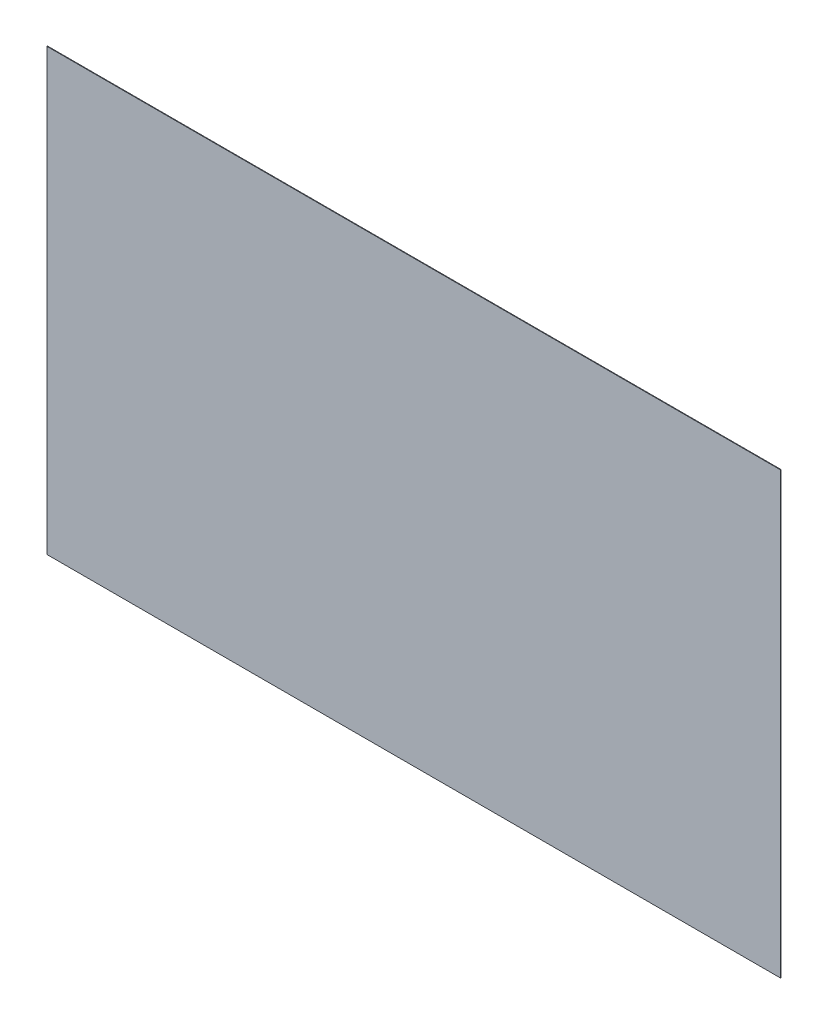
ISO-10303-21;
HEADER;
FILE_DESCRIPTION(('STEP AP214'),'2;1');
FILE_NAME('part.step','',(''),(''),'','','');
FILE_SCHEMA(('AUTOMOTIVE_DESIGN { 1 0 10303 214 1 1 1 1 }'));
ENDSEC;
DATA;
#1=APPLICATION_CONTEXT('core data for automotive mechanical design processes');
#2=APPLICATION_PROTOCOL_DEFINITION('international standard','automotive_design',2000,#1);
#3=PRODUCT_CONTEXT('',#1,'mechanical');
#4=PRODUCT('Part','Part','',(#3));
#5=PRODUCT_RELATED_PRODUCT_CATEGORY('part','',(#4));
#6=PRODUCT_DEFINITION_FORMATION('','',#4);
#7=PRODUCT_DEFINITION_CONTEXT('part definition',#1,'design');
#8=PRODUCT_DEFINITION('design','',#6,#7);
#9=PRODUCT_DEFINITION_SHAPE('','',#8);
#10=(LENGTH_UNIT() NAMED_UNIT(*) SI_UNIT(.MILLI.,.METRE.));
#11=(NAMED_UNIT(*) PLANE_ANGLE_UNIT() SI_UNIT($,.RADIAN.));
#12=(NAMED_UNIT(*) SI_UNIT($,.STERADIAN.) SOLID_ANGLE_UNIT());
#13=UNCERTAINTY_MEASURE_WITH_UNIT(LENGTH_MEASURE(1.E-05),#10,'distance_accuracy_value','');
#14=(GEOMETRIC_REPRESENTATION_CONTEXT(3) GLOBAL_UNCERTAINTY_ASSIGNED_CONTEXT((#13)) GLOBAL_UNIT_ASSIGNED_CONTEXT((#10,
#11,#12)) REPRESENTATION_CONTEXT('',''));
#15=CARTESIAN_POINT('',(0.,0.,0.));
#16=DIRECTION('',(0.,0.,1.));
#17=DIRECTION('',(1.,0.,0.));
#18=AXIS2_PLACEMENT_3D('',#15,#16,#17);
#19=CARTESIAN_POINT('',(0.,0.,0.8));
#20=DIRECTION('',(1.,0.,0.));
#21=DIRECTION('',(0.,1.,0.));
#22=AXIS2_PLACEMENT_3D('',#19,#20,#21);
#23=PLANE('',#22);
#24=DIRECTION('',(0.,-1.,0.));
#25=VECTOR('',#24,1.);
#26=CARTESIAN_POINT('',(0.,0.,0.));
#27=LINE('',#26,#25);
#28=CARTESIAN_POINT('',(-3.33066907387547E-13,600.,0.));
#29=VERTEX_POINT('',#28);
#30=CARTESIAN_POINT('',(0.,0.,0.));
#31=VERTEX_POINT('',#30);
#32=EDGE_CURVE('E99',#29,#31,#27,.T.);
#33=ORIENTED_EDGE('',*,*,#32,.T.);
#34=DIRECTION('',(0.,0.,-1.));
#35=VECTOR('',#34,1.);
#36=CARTESIAN_POINT('',(0.,0.,0.8));
#37=LINE('',#36,#35);
#38=CARTESIAN_POINT('',(0.,0.,0.8));
#39=VERTEX_POINT('',#38);
#40=EDGE_CURVE('E11',#39,#31,#37,.T.);
#41=ORIENTED_EDGE('',*,*,#40,.F.);
#42=DIRECTION('',(0.,-1.,0.));
#43=VECTOR('',#42,1.);
#44=CARTESIAN_POINT('',(0.,0.,0.8));
#45=LINE('',#44,#43);
#46=CARTESIAN_POINT('',(-3.33066907387547E-13,600.,0.8));
#47=VERTEX_POINT('',#46);
#48=EDGE_CURVE('E87',#47,#39,#45,.T.);
#49=ORIENTED_EDGE('',*,*,#48,.F.);
#50=DIRECTION('',(0.,0.,-1.));
#51=VECTOR('',#50,1.);
#52=CARTESIAN_POINT('',(-3.33066907387547E-13,600.,0.8));
#53=LINE('',#52,#51);
#54=EDGE_CURVE('E95',#47,#29,#53,.T.);
#55=ORIENTED_EDGE('',*,*,#54,.T.);
#56=EDGE_LOOP('',(#33,#41,#49,#55));
#57=FACE_BOUND('',#56,.T.);
#58=ADVANCED_FACE('F36',(#57),#23,.F.);
#59=CARTESIAN_POINT('',(0.,0.,0.8));
#60=DIRECTION('',(0.,1.,0.));
#61=DIRECTION('',(0.,0.,1.));
#62=AXIS2_PLACEMENT_3D('',#59,#60,#61);
#63=PLANE('',#62);
#64=DIRECTION('',(1.,0.,0.));
#65=VECTOR('',#64,1.);
#66=CARTESIAN_POINT('',(0.,0.,0.));
#67=LINE('',#66,#65);
#68=CARTESIAN_POINT('',(1000.,0.,0.));
#69=VERTEX_POINT('',#68);
#70=EDGE_CURVE('E91',#31,#69,#67,.T.);
#71=ORIENTED_EDGE('',*,*,#70,.T.);
#72=DIRECTION('',(0.,0.,-1.));
#73=VECTOR('',#72,1.);
#74=CARTESIAN_POINT('',(1000.,0.,0.8));
#75=LINE('',#74,#73);
#76=CARTESIAN_POINT('',(1000.,0.,0.8));
#77=VERTEX_POINT('',#76);
#78=EDGE_CURVE('E44',#77,#69,#75,.T.);
#79=ORIENTED_EDGE('',*,*,#78,.F.);
#80=DIRECTION('',(1.,0.,0.));
#81=VECTOR('',#80,1.);
#82=CARTESIAN_POINT('',(0.,0.,0.8));
#83=LINE('',#82,#81);
#84=EDGE_CURVE('E82',#39,#77,#83,.T.);
#85=ORIENTED_EDGE('',*,*,#84,.F.);
#86=ORIENTED_EDGE('',*,*,#40,.T.);
#87=EDGE_LOOP('',(#71,#79,#85,#86));
#88=FACE_BOUND('',#87,.T.);
#89=ADVANCED_FACE('F90',(#88),#63,.F.);
#90=CARTESIAN_POINT('',(1000.,0.,0.8));
#91=DIRECTION('',(-1.,0.,0.));
#92=DIRECTION('',(0.,-1.,0.));
#93=AXIS2_PLACEMENT_3D('',#90,#91,#92);
#94=PLANE('',#93);
#95=DIRECTION('',(0.,1.,0.));
#96=VECTOR('',#95,1.);
#97=CARTESIAN_POINT('',(1000.,0.,0.));
#98=LINE('',#97,#96);
#99=CARTESIAN_POINT('',(1000.,600.,0.));
#100=VERTEX_POINT('',#99);
#101=EDGE_CURVE('E69',#69,#100,#98,.T.);
#102=ORIENTED_EDGE('',*,*,#101,.T.);
#103=DIRECTION('',(0.,0.,-1.));
#104=VECTOR('',#103,1.);
#105=CARTESIAN_POINT('',(1000.,600.,0.8));
#106=LINE('',#105,#104);
#107=CARTESIAN_POINT('',(1000.,600.,0.8));
#108=VERTEX_POINT('',#107);
#109=EDGE_CURVE('E92',#108,#100,#106,.T.);
#110=ORIENTED_EDGE('',*,*,#109,.F.);
#111=DIRECTION('',(0.,1.,0.));
#112=VECTOR('',#111,1.);
#113=CARTESIAN_POINT('',(1000.,0.,0.8));
#114=LINE('',#113,#112);
#115=EDGE_CURVE('E85',#77,#108,#114,.T.);
#116=ORIENTED_EDGE('',*,*,#115,.F.);
#117=ORIENTED_EDGE('',*,*,#78,.T.);
#118=EDGE_LOOP('',(#102,#110,#116,#117));
#119=FACE_BOUND('',#118,.T.);
#120=ADVANCED_FACE('F93',(#119),#94,.F.);
#121=CARTESIAN_POINT('',(-3.33066907387547E-13,600.,0.8));
#122=DIRECTION('',(0.,-1.,0.));
#123=DIRECTION('',(0.,0.,-1.));
#124=AXIS2_PLACEMENT_3D('',#121,#122,#123);
#125=PLANE('',#124);
#126=DIRECTION('',(-1.,0.,0.));
#127=VECTOR('',#126,1.);
#128=CARTESIAN_POINT('',(-3.33066907387547E-13,600.,0.));
#129=LINE('',#128,#127);
#130=EDGE_CURVE('E75',#100,#29,#129,.T.);
#131=ORIENTED_EDGE('',*,*,#130,.T.);
#132=ORIENTED_EDGE('',*,*,#54,.F.);
#133=DIRECTION('',(-1.,0.,0.));
#134=VECTOR('',#133,1.);
#135=CARTESIAN_POINT('',(-3.33066907387547E-13,600.,0.8));
#136=LINE('',#135,#134);
#137=EDGE_CURVE('E52',#108,#47,#136,.T.);
#138=ORIENTED_EDGE('',*,*,#137,.F.);
#139=ORIENTED_EDGE('',*,*,#109,.T.);
#140=EDGE_LOOP('',(#131,#132,#138,#139));
#141=FACE_BOUND('',#140,.T.);
#142=ADVANCED_FACE('F106',(#141),#125,.F.);
#143=CARTESIAN_POINT('',(0.,0.,0.8));
#144=DIRECTION('',(0.,0.,-1.));
#145=DIRECTION('',(-1.,0.,0.));
#146=AXIS2_PLACEMENT_3D('',#143,#144,#145);
#147=PLANE('',#146);
#148=ORIENTED_EDGE('',*,*,#48,.T.);
#149=ORIENTED_EDGE('',*,*,#84,.T.);
#150=ORIENTED_EDGE('',*,*,#115,.T.);
#151=ORIENTED_EDGE('',*,*,#137,.T.);
#152=EDGE_LOOP('',(#148,#149,#150,#151));
#153=FACE_BOUND('',#152,.T.);
#154=ADVANCED_FACE('F83',(#153),#147,.F.);
#155=CARTESIAN_POINT('',(0.,0.,0.));
#156=DIRECTION('',(0.,0.,-1.));
#157=DIRECTION('',(-1.,0.,0.));
#158=AXIS2_PLACEMENT_3D('',#155,#156,#157);
#159=PLANE('',#158);
#160=ORIENTED_EDGE('',*,*,#32,.F.);
#161=ORIENTED_EDGE('',*,*,#130,.F.);
#162=ORIENTED_EDGE('',*,*,#101,.F.);
#163=ORIENTED_EDGE('',*,*,#70,.F.);
#164=EDGE_LOOP('',(#160,#161,#162,#163));
#165=FACE_BOUND('',#164,.T.);
#166=ADVANCED_FACE('F109',(#165),#159,.T.);
#167=CLOSED_SHELL('',(#58,#89,#120,#142,#154,#166));
#168=MANIFOLD_SOLID_BREP('B2',#167);
#169=ADVANCED_BREP_SHAPE_REPRESENTATION('',(#18,#168),#14);
#170=SHAPE_DEFINITION_REPRESENTATION(#9,#169);
ENDSEC;
END-ISO-10303-21;
